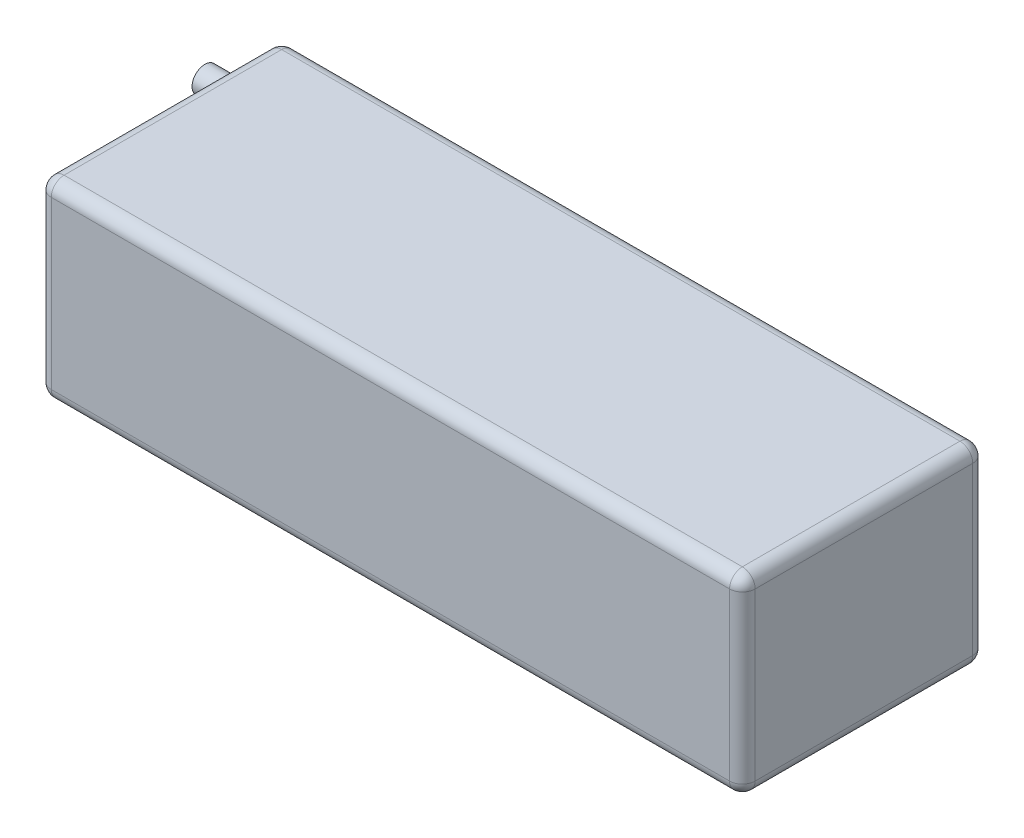
ISO-10303-21;
HEADER;
FILE_DESCRIPTION(('STEP AP214'),'2;1');
FILE_NAME('part.step','',(''),(''),'','','');
FILE_SCHEMA(('AUTOMOTIVE_DESIGN { 1 0 10303 214 1 1 1 1 }'));
ENDSEC;
DATA;
#1=APPLICATION_CONTEXT('core data for automotive mechanical design processes');
#2=APPLICATION_PROTOCOL_DEFINITION('international standard','automotive_design',2000,#1);
#3=PRODUCT_CONTEXT('',#1,'mechanical');
#4=PRODUCT('Part','Part','',(#3));
#5=PRODUCT_RELATED_PRODUCT_CATEGORY('part','',(#4));
#6=PRODUCT_DEFINITION_FORMATION('','',#4);
#7=PRODUCT_DEFINITION_CONTEXT('part definition',#1,'design');
#8=PRODUCT_DEFINITION('design','',#6,#7);
#9=PRODUCT_DEFINITION_SHAPE('','',#8);
#10=(LENGTH_UNIT() NAMED_UNIT(*) SI_UNIT(.MILLI.,.METRE.));
#11=(NAMED_UNIT(*) PLANE_ANGLE_UNIT() SI_UNIT($,.RADIAN.));
#12=(NAMED_UNIT(*) SI_UNIT($,.STERADIAN.) SOLID_ANGLE_UNIT());
#13=UNCERTAINTY_MEASURE_WITH_UNIT(LENGTH_MEASURE(1.E-05),#10,'distance_accuracy_value','');
#14=(GEOMETRIC_REPRESENTATION_CONTEXT(3) GLOBAL_UNCERTAINTY_ASSIGNED_CONTEXT((#13)) GLOBAL_UNIT_ASSIGNED_CONTEXT((#10,
#11,#12)) REPRESENTATION_CONTEXT('',''));
#15=CARTESIAN_POINT('',(0.,0.,0.));
#16=DIRECTION('',(0.,0.,1.));
#17=DIRECTION('',(1.,0.,0.));
#18=AXIS2_PLACEMENT_3D('',#15,#16,#17);
#19=CARTESIAN_POINT('',(-55.,30.,19.));
#20=DIRECTION('',(1.,0.,0.));
#21=DIRECTION('',(0.,0.,-1.));
#22=AXIS2_PLACEMENT_3D('',#19,#20,#21);
#23=PLANE('',#22);
#24=CARTESIAN_POINT('',(-55.,10.,-17.));
#25=DIRECTION('',(1.,0.,0.));
#26=DIRECTION('',(0.,0.,-1.));
#27=AXIS2_PLACEMENT_3D('',#24,#25,#26);
#28=CIRCLE('',#27,2.);
#29=CARTESIAN_POINT('',(-55.,8.,-17.));
#30=VERTEX_POINT('',#29);
#31=CARTESIAN_POINT('',(-55.,12.,-17.));
#32=VERTEX_POINT('',#31);
#33=EDGE_CURVE('E50',#30,#32,#28,.F.);
#34=ORIENTED_EDGE('',*,*,#33,.F.);
#35=DIRECTION('',(0.,-1.,0.));
#36=VECTOR('',#35,1.);
#37=CARTESIAN_POINT('',(-55.,30.,-17.));
#38=LINE('',#37,#36);
#39=CARTESIAN_POINT('',(-55.,2.,-17.));
#40=VERTEX_POINT('',#39);
#41=EDGE_CURVE('E168',#30,#40,#38,.T.);
#42=ORIENTED_EDGE('',*,*,#41,.T.);
#43=DIRECTION('',(0.,0.,1.));
#44=VECTOR('',#43,1.);
#45=CARTESIAN_POINT('',(-55.,2.,19.));
#46=LINE('',#45,#44);
#47=CARTESIAN_POINT('',(-55.,2.,17.));
#48=VERTEX_POINT('',#47);
#49=EDGE_CURVE('E205',#40,#48,#46,.T.);
#50=ORIENTED_EDGE('',*,*,#49,.T.);
#51=DIRECTION('',(0.,-1.,0.));
#52=VECTOR('',#51,1.);
#53=CARTESIAN_POINT('',(-55.,30.,17.));
#54=LINE('',#53,#52);
#55=CARTESIAN_POINT('',(-55.,28.,17.));
#56=VERTEX_POINT('',#55);
#57=EDGE_CURVE('E203',#48,#56,#54,.F.);
#58=ORIENTED_EDGE('',*,*,#57,.T.);
#59=DIRECTION('',(0.,0.,1.));
#60=VECTOR('',#59,1.);
#61=CARTESIAN_POINT('',(-55.,28.,-19.));
#62=LINE('',#61,#60);
#63=CARTESIAN_POINT('',(-55.,28.,-17.));
#64=VERTEX_POINT('',#63);
#65=EDGE_CURVE('E201',#56,#64,#62,.F.);
#66=ORIENTED_EDGE('',*,*,#65,.T.);
#67=CARTESIAN_POINT('',(-55.,22.,-17.));
#68=VERTEX_POINT('',#67);
#69=EDGE_CURVE('E197',#64,#68,#38,.T.);
#70=ORIENTED_EDGE('',*,*,#69,.T.);
#71=CARTESIAN_POINT('',(-55.,20.,-17.));
#72=DIRECTION('',(1.,0.,0.));
#73=DIRECTION('',(0.,0.,-1.));
#74=AXIS2_PLACEMENT_3D('',#71,#72,#73);
#75=CIRCLE('',#74,2.);
#76=CARTESIAN_POINT('',(-55.,18.,-17.));
#77=VERTEX_POINT('',#76);
#78=EDGE_CURVE('E208',#77,#68,#75,.F.);
#79=ORIENTED_EDGE('',*,*,#78,.F.);
#80=CARTESIAN_POINT('',(-55.,17.,-17.));
#81=VERTEX_POINT('',#80);
#82=EDGE_CURVE('E200',#77,#81,#38,.T.);
#83=ORIENTED_EDGE('',*,*,#82,.T.);
#84=CARTESIAN_POINT('',(-55.,15.,-17.));
#85=DIRECTION('',(1.,0.,0.));
#86=DIRECTION('',(0.,0.,-1.));
#87=AXIS2_PLACEMENT_3D('',#84,#85,#86);
#88=CIRCLE('',#87,2.);
#89=CARTESIAN_POINT('',(-55.,13.,-17.));
#90=VERTEX_POINT('',#89);
#91=EDGE_CURVE('E58',#90,#81,#88,.F.);
#92=ORIENTED_EDGE('',*,*,#91,.F.);
#93=EDGE_CURVE('E691',#90,#32,#38,.T.);
#94=ORIENTED_EDGE('',*,*,#93,.T.);
#95=EDGE_LOOP('',(#34,#42,#50,#58,#66,#70,#79,#83,#92,#94));
#96=FACE_BOUND('',#95,.T.);
#97=ADVANCED_FACE('F35',(#96),#23,.F.);
#98=CARTESIAN_POINT('',(-53.,30.,-17.));
#99=DIRECTION('',(0.,-1.,0.));
#100=DIRECTION('',(0.,0.,-1.));
#101=AXIS2_PLACEMENT_3D('',#98,#99,#100);
#102=CYLINDRICAL_SURFACE('',#101,2.);
#103=ORIENTED_EDGE('',*,*,#41,.F.);
#104=CARTESIAN_POINT('',(-53.,10.,-17.));
#105=DIRECTION('',(0.707106781186547,-0.707106781186547,0.));
#106=DIRECTION('',(-0.707106781186547,-0.707106781186547,0.));
#107=AXIS2_PLACEMENT_3D('',#104,#105,#106);
#108=ELLIPSE('',#107,2.82842712474619,2.);
#109=CARTESIAN_POINT('',(-53.,10.,-19.));
#110=VERTEX_POINT('',#109);
#111=EDGE_CURVE('E153',#30,#110,#108,.T.);
#112=ORIENTED_EDGE('',*,*,#111,.T.);
#113=DIRECTION('',(0.,-1.,0.));
#114=VECTOR('',#113,1.);
#115=CARTESIAN_POINT('',(-53.,30.,-19.));
#116=LINE('',#115,#114);
#117=CARTESIAN_POINT('',(-53.,2.,-19.));
#118=VERTEX_POINT('',#117);
#119=EDGE_CURVE('E166',#118,#110,#116,.F.);
#120=ORIENTED_EDGE('',*,*,#119,.F.);
#121=CARTESIAN_POINT('',(-53.,2.,-17.));
#122=DIRECTION('',(0.,-1.,0.));
#123=DIRECTION('',(0.,0.,-1.));
#124=AXIS2_PLACEMENT_3D('',#121,#122,#123);
#125=CIRCLE('',#124,2.);
#126=EDGE_CURVE('E210',#118,#40,#125,.F.);
#127=ORIENTED_EDGE('',*,*,#126,.T.);
#128=EDGE_LOOP('',(#103,#112,#120,#127));
#129=FACE_BOUND('',#128,.T.);
#130=ADVANCED_FACE('F163',(#129),#102,.T.);
#131=CARTESIAN_POINT('',(-53.,15.,-19.));
#132=VERTEX_POINT('',#131);
#133=EDGE_CURVE('E172',#110,#132,#116,.F.);
#134=ORIENTED_EDGE('',*,*,#133,.F.);
#135=CARTESIAN_POINT('',(-53.,10.,-17.));
#136=DIRECTION('',(-0.707106781186547,-0.707106781186547,0.));
#137=DIRECTION('',(0.707106781186547,-0.707106781186547,0.));
#138=AXIS2_PLACEMENT_3D('',#135,#136,#137);
#139=ELLIPSE('',#138,2.82842712474619,2.);
#140=EDGE_CURVE('E149',#110,#32,#139,.F.);
#141=ORIENTED_EDGE('',*,*,#140,.T.);
#142=ORIENTED_EDGE('',*,*,#93,.F.);
#143=CARTESIAN_POINT('',(-53.,15.,-17.));
#144=DIRECTION('',(0.707106781186547,-0.707106781186547,0.));
#145=DIRECTION('',(-0.707106781186547,-0.707106781186547,0.));
#146=AXIS2_PLACEMENT_3D('',#143,#144,#145);
#147=ELLIPSE('',#146,2.82842712474619,2.);
#148=EDGE_CURVE('E174',#90,#132,#147,.T.);
#149=ORIENTED_EDGE('',*,*,#148,.T.);
#150=EDGE_LOOP('',(#134,#141,#142,#149));
#151=FACE_BOUND('',#150,.T.);
#152=ADVANCED_FACE('F173',(#151),#102,.T.);
#153=CARTESIAN_POINT('',(-53.,20.,-19.));
#154=VERTEX_POINT('',#153);
#155=EDGE_CURVE('E177',#132,#154,#116,.F.);
#156=ORIENTED_EDGE('',*,*,#155,.F.);
#157=CARTESIAN_POINT('',(-53.,15.,-17.));
#158=DIRECTION('',(-0.707106781186547,-0.707106781186547,0.));
#159=DIRECTION('',(0.707106781186547,-0.707106781186547,0.));
#160=AXIS2_PLACEMENT_3D('',#157,#158,#159);
#161=ELLIPSE('',#160,2.82842712474619,2.);
#162=EDGE_CURVE('E216',#132,#81,#161,.F.);
#163=ORIENTED_EDGE('',*,*,#162,.T.);
#164=ORIENTED_EDGE('',*,*,#82,.F.);
#165=CARTESIAN_POINT('',(-53.,20.,-17.));
#166=DIRECTION('',(0.707106781186547,-0.707106781186547,0.));
#167=DIRECTION('',(-0.707106781186547,-0.707106781186547,0.));
#168=AXIS2_PLACEMENT_3D('',#165,#166,#167);
#169=ELLIPSE('',#168,2.82842712474619,2.);
#170=EDGE_CURVE('E11',#77,#154,#169,.T.);
#171=ORIENTED_EDGE('',*,*,#170,.T.);
#172=EDGE_LOOP('',(#156,#163,#164,#171));
#173=FACE_BOUND('',#172,.T.);
#174=ADVANCED_FACE('F481',(#173),#102,.T.);
#175=CARTESIAN_POINT('',(-53.,28.,-19.));
#176=VERTEX_POINT('',#175);
#177=EDGE_CURVE('E184',#154,#176,#116,.F.);
#178=ORIENTED_EDGE('',*,*,#177,.F.);
#179=CARTESIAN_POINT('',(-53.,20.,-17.));
#180=DIRECTION('',(-0.707106781186547,-0.707106781186547,0.));
#181=DIRECTION('',(0.707106781186547,-0.707106781186547,0.));
#182=AXIS2_PLACEMENT_3D('',#179,#180,#181);
#183=ELLIPSE('',#182,2.82842712474619,2.);
#184=EDGE_CURVE('E43',#154,#68,#183,.F.);
#185=ORIENTED_EDGE('',*,*,#184,.T.);
#186=ORIENTED_EDGE('',*,*,#69,.F.);
#187=CARTESIAN_POINT('',(-53.,28.,-17.));
#188=DIRECTION('',(0.,1.,0.));
#189=DIRECTION('',(0.,0.,1.));
#190=AXIS2_PLACEMENT_3D('',#187,#188,#189);
#191=CIRCLE('',#190,2.);
#192=EDGE_CURVE('E372',#64,#176,#191,.F.);
#193=ORIENTED_EDGE('',*,*,#192,.T.);
#194=EDGE_LOOP('',(#178,#185,#186,#193));
#195=FACE_BOUND('',#194,.T.);
#196=ADVANCED_FACE('F243',(#195),#102,.T.);
#197=CARTESIAN_POINT('',(55.,30.,19.));
#198=DIRECTION('',(0.,0.,-1.));
#199=DIRECTION('',(-1.,0.,0.));
#200=AXIS2_PLACEMENT_3D('',#197,#198,#199);
#201=PLANE('',#200);
#202=DIRECTION('',(1.,0.,0.));
#203=VECTOR('',#202,1.);
#204=CARTESIAN_POINT('',(-55.,28.,19.));
#205=LINE('',#204,#203);
#206=CARTESIAN_POINT('',(53.,28.,19.));
#207=VERTEX_POINT('',#206);
#208=CARTESIAN_POINT('',(-53.,28.,19.));
#209=VERTEX_POINT('',#208);
#210=EDGE_CURVE('E338',#207,#209,#205,.F.);
#211=ORIENTED_EDGE('',*,*,#210,.T.);
#212=DIRECTION('',(0.,-1.,0.));
#213=VECTOR('',#212,1.);
#214=CARTESIAN_POINT('',(-53.,30.,19.));
#215=LINE('',#214,#213);
#216=CARTESIAN_POINT('',(-53.,2.,19.));
#217=VERTEX_POINT('',#216);
#218=EDGE_CURVE('E345',#209,#217,#215,.T.);
#219=ORIENTED_EDGE('',*,*,#218,.T.);
#220=DIRECTION('',(1.,0.,0.));
#221=VECTOR('',#220,1.);
#222=CARTESIAN_POINT('',(55.,2.,19.));
#223=LINE('',#222,#221);
#224=CARTESIAN_POINT('',(53.,2.,19.));
#225=VERTEX_POINT('',#224);
#226=EDGE_CURVE('E350',#217,#225,#223,.T.);
#227=ORIENTED_EDGE('',*,*,#226,.T.);
#228=DIRECTION('',(0.,-1.,0.));
#229=VECTOR('',#228,1.);
#230=CARTESIAN_POINT('',(53.,30.,19.));
#231=LINE('',#230,#229);
#232=EDGE_CURVE('E346',#225,#207,#231,.F.);
#233=ORIENTED_EDGE('',*,*,#232,.T.);
#234=EDGE_LOOP('',(#211,#219,#227,#233));
#235=FACE_BOUND('',#234,.T.);
#236=ADVANCED_FACE('F245',(#235),#201,.F.);
#237=CARTESIAN_POINT('',(55.,30.,19.));
#238=DIRECTION('',(-1.,0.,0.));
#239=DIRECTION('',(0.,0.,1.));
#240=AXIS2_PLACEMENT_3D('',#237,#238,#239);
#241=PLANE('',#240);
#242=DIRECTION('',(0.,0.,-1.));
#243=VECTOR('',#242,1.);
#244=CARTESIAN_POINT('',(55.,28.,19.));
#245=LINE('',#244,#243);
#246=CARTESIAN_POINT('',(55.,28.,-17.));
#247=VERTEX_POINT('',#246);
#248=CARTESIAN_POINT('',(55.,28.,17.));
#249=VERTEX_POINT('',#248);
#250=EDGE_CURVE('E357',#247,#249,#245,.F.);
#251=ORIENTED_EDGE('',*,*,#250,.T.);
#252=DIRECTION('',(0.,-1.,0.));
#253=VECTOR('',#252,1.);
#254=CARTESIAN_POINT('',(55.,30.,17.));
#255=LINE('',#254,#253);
#256=CARTESIAN_POINT('',(55.,2.,17.));
#257=VERTEX_POINT('',#256);
#258=EDGE_CURVE('E359',#249,#257,#255,.T.);
#259=ORIENTED_EDGE('',*,*,#258,.T.);
#260=DIRECTION('',(0.,0.,-1.));
#261=VECTOR('',#260,1.);
#262=CARTESIAN_POINT('',(55.,2.,19.));
#263=LINE('',#262,#261);
#264=CARTESIAN_POINT('',(55.,2.,-17.));
#265=VERTEX_POINT('',#264);
#266=EDGE_CURVE('E348',#257,#265,#263,.T.);
#267=ORIENTED_EDGE('',*,*,#266,.T.);
#268=DIRECTION('',(0.,-1.,0.));
#269=VECTOR('',#268,1.);
#270=CARTESIAN_POINT('',(55.,30.,-17.));
#271=LINE('',#270,#269);
#272=EDGE_CURVE('E355',#265,#247,#271,.F.);
#273=ORIENTED_EDGE('',*,*,#272,.T.);
#274=EDGE_LOOP('',(#251,#259,#267,#273));
#275=FACE_BOUND('',#274,.T.);
#276=ADVANCED_FACE('F469',(#275),#241,.F.);
#277=CARTESIAN_POINT('',(55.,30.,-19.));
#278=DIRECTION('',(0.,0.,1.));
#279=DIRECTION('',(1.,0.,0.));
#280=AXIS2_PLACEMENT_3D('',#277,#278,#279);
#281=PLANE('',#280);
#282=ORIENTED_EDGE('',*,*,#119,.T.);
#283=ORIENTED_EDGE('',*,*,#133,.T.);
#284=ORIENTED_EDGE('',*,*,#155,.T.);
#285=ORIENTED_EDGE('',*,*,#177,.T.);
#286=DIRECTION('',(-1.,0.,0.));
#287=VECTOR('',#286,1.);
#288=CARTESIAN_POINT('',(55.,28.,-19.));
#289=LINE('',#288,#287);
#290=CARTESIAN_POINT('',(53.,28.,-19.));
#291=VERTEX_POINT('',#290);
#292=EDGE_CURVE('E188',#176,#291,#289,.F.);
#293=ORIENTED_EDGE('',*,*,#292,.T.);
#294=DIRECTION('',(0.,-1.,0.));
#295=VECTOR('',#294,1.);
#296=CARTESIAN_POINT('',(53.,30.,-19.));
#297=LINE('',#296,#295);
#298=CARTESIAN_POINT('',(53.,2.,-19.));
#299=VERTEX_POINT('',#298);
#300=EDGE_CURVE('E191',#291,#299,#297,.T.);
#301=ORIENTED_EDGE('',*,*,#300,.T.);
#302=DIRECTION('',(-1.,0.,0.));
#303=VECTOR('',#302,1.);
#304=CARTESIAN_POINT('',(55.,2.,-19.));
#305=LINE('',#304,#303);
#306=EDGE_CURVE('E181',#299,#118,#305,.T.);
#307=ORIENTED_EDGE('',*,*,#306,.T.);
#308=EDGE_LOOP('',(#282,#283,#284,#285,#293,#301,#307));
#309=FACE_BOUND('',#308,.T.);
#310=ADVANCED_FACE('F179',(#309),#281,.F.);
#311=CARTESIAN_POINT('',(0.,30.,0.));
#312=DIRECTION('',(0.,1.,0.));
#313=DIRECTION('',(0.,0.,1.));
#314=AXIS2_PLACEMENT_3D('',#311,#312,#313);
#315=PLANE('',#314);
#316=DIRECTION('',(0.,0.,-1.));
#317=VECTOR('',#316,1.);
#318=CARTESIAN_POINT('',(53.,30.,-19.));
#319=LINE('',#318,#317);
#320=CARTESIAN_POINT('',(53.,30.,17.));
#321=VERTEX_POINT('',#320);
#322=CARTESIAN_POINT('',(53.,30.,-17.));
#323=VERTEX_POINT('',#322);
#324=EDGE_CURVE('E183',#321,#323,#319,.T.);
#325=ORIENTED_EDGE('',*,*,#324,.T.);
#326=DIRECTION('',(-1.,0.,0.));
#327=VECTOR('',#326,1.);
#328=CARTESIAN_POINT('',(-55.,30.,-17.));
#329=LINE('',#328,#327);
#330=CARTESIAN_POINT('',(-53.,30.,-17.));
#331=VERTEX_POINT('',#330);
#332=EDGE_CURVE('E445',#323,#331,#329,.T.);
#333=ORIENTED_EDGE('',*,*,#332,.T.);
#334=DIRECTION('',(0.,0.,1.));
#335=VECTOR('',#334,1.);
#336=CARTESIAN_POINT('',(-53.,30.,19.));
#337=LINE('',#336,#335);
#338=CARTESIAN_POINT('',(-53.,30.,17.));
#339=VERTEX_POINT('',#338);
#340=EDGE_CURVE('E440',#331,#339,#337,.T.);
#341=ORIENTED_EDGE('',*,*,#340,.T.);
#342=DIRECTION('',(1.,0.,0.));
#343=VECTOR('',#342,1.);
#344=CARTESIAN_POINT('',(55.,30.,17.));
#345=LINE('',#344,#343);
#346=EDGE_CURVE('E185',#339,#321,#345,.T.);
#347=ORIENTED_EDGE('',*,*,#346,.T.);
#348=EDGE_LOOP('',(#325,#333,#341,#347));
#349=FACE_BOUND('',#348,.T.);
#350=ADVANCED_FACE('F472',(#349),#315,.T.);
#351=CARTESIAN_POINT('',(0.,0.,0.));
#352=DIRECTION('',(0.,1.,0.));
#353=DIRECTION('',(0.,0.,1.));
#354=AXIS2_PLACEMENT_3D('',#351,#352,#353);
#355=PLANE('',#354);
#356=DIRECTION('',(0.,0.,-1.));
#357=VECTOR('',#356,1.);
#358=CARTESIAN_POINT('',(53.,0.,0.));
#359=LINE('',#358,#357);
#360=CARTESIAN_POINT('',(53.,0.,-17.));
#361=VERTEX_POINT('',#360);
#362=CARTESIAN_POINT('',(53.,0.,17.));
#363=VERTEX_POINT('',#362);
#364=EDGE_CURVE('E366',#361,#363,#359,.F.);
#365=ORIENTED_EDGE('',*,*,#364,.T.);
#366=DIRECTION('',(1.,0.,0.));
#367=VECTOR('',#366,1.);
#368=CARTESIAN_POINT('',(0.,0.,17.));
#369=LINE('',#368,#367);
#370=CARTESIAN_POINT('',(-53.,0.,17.));
#371=VERTEX_POINT('',#370);
#372=EDGE_CURVE('E368',#363,#371,#369,.F.);
#373=ORIENTED_EDGE('',*,*,#372,.T.);
#374=DIRECTION('',(0.,0.,1.));
#375=VECTOR('',#374,1.);
#376=CARTESIAN_POINT('',(-53.,0.,0.));
#377=LINE('',#376,#375);
#378=CARTESIAN_POINT('',(-53.,0.,-17.));
#379=VERTEX_POINT('',#378);
#380=EDGE_CURVE('E362',#371,#379,#377,.F.);
#381=ORIENTED_EDGE('',*,*,#380,.T.);
#382=DIRECTION('',(-1.,0.,0.));
#383=VECTOR('',#382,1.);
#384=CARTESIAN_POINT('',(0.,0.,-17.));
#385=LINE('',#384,#383);
#386=EDGE_CURVE('E364',#379,#361,#385,.F.);
#387=ORIENTED_EDGE('',*,*,#386,.T.);
#388=EDGE_LOOP('',(#365,#373,#381,#387));
#389=FACE_BOUND('',#388,.T.);
#390=ADVANCED_FACE('F322',(#389),#355,.F.);
#391=CARTESIAN_POINT('',(53.,30.,17.));
#392=DIRECTION('',(0.,-1.,0.));
#393=DIRECTION('',(0.,0.,-1.));
#394=AXIS2_PLACEMENT_3D('',#391,#392,#393);
#395=CYLINDRICAL_SURFACE('',#394,2.);
#396=CARTESIAN_POINT('',(53.,28.,17.));
#397=DIRECTION('',(0.,1.,0.));
#398=DIRECTION('',(0.,0.,1.));
#399=AXIS2_PLACEMENT_3D('',#396,#397,#398);
#400=CIRCLE('',#399,2.);
#401=EDGE_CURVE('E207',#207,#249,#400,.T.);
#402=ORIENTED_EDGE('',*,*,#401,.F.);
#403=ORIENTED_EDGE('',*,*,#232,.F.);
#404=CARTESIAN_POINT('',(53.,2.,17.));
#405=DIRECTION('',(0.,-1.,0.));
#406=DIRECTION('',(0.,0.,-1.));
#407=AXIS2_PLACEMENT_3D('',#404,#405,#406);
#408=CIRCLE('',#407,2.);
#409=EDGE_CURVE('E423',#257,#225,#408,.T.);
#410=ORIENTED_EDGE('',*,*,#409,.F.);
#411=ORIENTED_EDGE('',*,*,#258,.F.);
#412=EDGE_LOOP('',(#402,#403,#410,#411));
#413=FACE_BOUND('',#412,.T.);
#414=ADVANCED_FACE('F37',(#413),#395,.T.);
#415=CARTESIAN_POINT('',(53.,28.,17.));
#416=DIRECTION('',(0.,0.,1.));
#417=DIRECTION('',(1.,0.,0.));
#418=AXIS2_PLACEMENT_3D('',#415,#416,#417);
#419=SPHERICAL_SURFACE('',#418,2.);
#420=CARTESIAN_POINT('',(53.,28.,17.));
#421=DIRECTION('',(1.,0.,0.));
#422=DIRECTION('',(0.,0.,-1.));
#423=AXIS2_PLACEMENT_3D('',#420,#421,#422);
#424=CIRCLE('',#423,2.);
#425=EDGE_CURVE('E328',#207,#321,#424,.F.);
#426=ORIENTED_EDGE('',*,*,#425,.F.);
#427=ORIENTED_EDGE('',*,*,#401,.T.);
#428=CARTESIAN_POINT('',(53.,28.,17.));
#429=DIRECTION('',(0.,0.,1.));
#430=DIRECTION('',(1.,0.,0.));
#431=AXIS2_PLACEMENT_3D('',#428,#429,#430);
#432=CIRCLE('',#431,2.);
#433=EDGE_CURVE('E332',#321,#249,#432,.F.);
#434=ORIENTED_EDGE('',*,*,#433,.F.);
#435=EDGE_LOOP('',(#426,#427,#434));
#436=FACE_BOUND('',#435,.T.);
#437=ADVANCED_FACE('F315',(#436),#419,.T.);
#438=CARTESIAN_POINT('',(53.,2.,17.));
#439=DIRECTION('',(0.,0.,1.));
#440=DIRECTION('',(1.,0.,0.));
#441=AXIS2_PLACEMENT_3D('',#438,#439,#440);
#442=SPHERICAL_SURFACE('',#441,2.);
#443=CARTESIAN_POINT('',(53.,2.,17.));
#444=DIRECTION('',(0.,0.,1.));
#445=DIRECTION('',(1.,0.,0.));
#446=AXIS2_PLACEMENT_3D('',#443,#444,#445);
#447=CIRCLE('',#446,2.);
#448=EDGE_CURVE('E417',#257,#363,#447,.F.);
#449=ORIENTED_EDGE('',*,*,#448,.F.);
#450=ORIENTED_EDGE('',*,*,#409,.T.);
#451=CARTESIAN_POINT('',(53.,2.,17.));
#452=DIRECTION('',(1.,0.,0.));
#453=DIRECTION('',(0.,0.,-1.));
#454=AXIS2_PLACEMENT_3D('',#451,#452,#453);
#455=CIRCLE('',#454,2.);
#456=EDGE_CURVE('E335',#363,#225,#455,.F.);
#457=ORIENTED_EDGE('',*,*,#456,.F.);
#458=EDGE_LOOP('',(#449,#450,#457));
#459=FACE_BOUND('',#458,.T.);
#460=ADVANCED_FACE('F312',(#459),#442,.T.);
#461=CARTESIAN_POINT('',(53.,28.,0.));
#462=DIRECTION('',(0.,0.,1.));
#463=DIRECTION('',(1.,0.,0.));
#464=AXIS2_PLACEMENT_3D('',#461,#462,#463);
#465=CYLINDRICAL_SURFACE('',#464,2.);
#466=ORIENTED_EDGE('',*,*,#433,.T.);
#467=ORIENTED_EDGE('',*,*,#250,.F.);
#468=CARTESIAN_POINT('',(53.,28.,-17.));
#469=DIRECTION('',(0.,0.,-1.));
#470=DIRECTION('',(-1.,0.,0.));
#471=AXIS2_PLACEMENT_3D('',#468,#469,#470);
#472=CIRCLE('',#471,2.);
#473=EDGE_CURVE('E411',#323,#247,#472,.T.);
#474=ORIENTED_EDGE('',*,*,#473,.F.);
#475=ORIENTED_EDGE('',*,*,#324,.F.);
#476=EDGE_LOOP('',(#466,#467,#474,#475));
#477=FACE_BOUND('',#476,.T.);
#478=ADVANCED_FACE('F308',(#477),#465,.T.);
#479=CARTESIAN_POINT('',(0.,28.,17.));
#480=DIRECTION('',(-1.,0.,0.));
#481=DIRECTION('',(0.,0.,1.));
#482=AXIS2_PLACEMENT_3D('',#479,#480,#481);
#483=CYLINDRICAL_SURFACE('',#482,2.);
#484=ORIENTED_EDGE('',*,*,#425,.T.);
#485=ORIENTED_EDGE('',*,*,#346,.F.);
#486=CARTESIAN_POINT('',(-53.,28.,17.));
#487=DIRECTION('',(-1.,0.,0.));
#488=DIRECTION('',(0.,0.,1.));
#489=AXIS2_PLACEMENT_3D('',#486,#487,#488);
#490=CIRCLE('',#489,2.);
#491=EDGE_CURVE('E340',#209,#339,#490,.T.);
#492=ORIENTED_EDGE('',*,*,#491,.F.);
#493=ORIENTED_EDGE('',*,*,#210,.F.);
#494=EDGE_LOOP('',(#484,#485,#492,#493));
#495=FACE_BOUND('',#494,.T.);
#496=ADVANCED_FACE('F304',(#495),#483,.T.);
#497=CARTESIAN_POINT('',(-53.,30.,17.));
#498=DIRECTION('',(0.,-1.,0.));
#499=DIRECTION('',(0.,0.,-1.));
#500=AXIS2_PLACEMENT_3D('',#497,#498,#499);
#501=CYLINDRICAL_SURFACE('',#500,2.);
#502=CARTESIAN_POINT('',(-53.,2.,17.));
#503=DIRECTION('',(0.,-1.,0.));
#504=DIRECTION('',(0.,0.,-1.));
#505=AXIS2_PLACEMENT_3D('',#502,#503,#504);
#506=CIRCLE('',#505,2.);
#507=EDGE_CURVE('E405',#217,#48,#506,.T.);
#508=ORIENTED_EDGE('',*,*,#507,.F.);
#509=ORIENTED_EDGE('',*,*,#218,.F.);
#510=CARTESIAN_POINT('',(-53.,28.,17.));
#511=DIRECTION('',(0.,1.,0.));
#512=DIRECTION('',(0.,0.,1.));
#513=AXIS2_PLACEMENT_3D('',#510,#511,#512);
#514=CIRCLE('',#513,2.);
#515=EDGE_CURVE('E408',#56,#209,#514,.T.);
#516=ORIENTED_EDGE('',*,*,#515,.F.);
#517=ORIENTED_EDGE('',*,*,#57,.F.);
#518=EDGE_LOOP('',(#508,#509,#516,#517));
#519=FACE_BOUND('',#518,.T.);
#520=ADVANCED_FACE('F300',(#519),#501,.T.);
#521=CARTESIAN_POINT('',(55.,2.,17.));
#522=DIRECTION('',(1.,0.,0.));
#523=DIRECTION('',(0.,0.,-1.));
#524=AXIS2_PLACEMENT_3D('',#521,#522,#523);
#525=CYLINDRICAL_SURFACE('',#524,2.);
#526=ORIENTED_EDGE('',*,*,#456,.T.);
#527=ORIENTED_EDGE('',*,*,#226,.F.);
#528=CARTESIAN_POINT('',(-53.,2.,17.));
#529=DIRECTION('',(-1.,0.,0.));
#530=DIRECTION('',(0.,0.,1.));
#531=AXIS2_PLACEMENT_3D('',#528,#529,#530);
#532=CIRCLE('',#531,2.);
#533=EDGE_CURVE('E403',#371,#217,#532,.T.);
#534=ORIENTED_EDGE('',*,*,#533,.F.);
#535=ORIENTED_EDGE('',*,*,#372,.F.);
#536=EDGE_LOOP('',(#526,#527,#534,#535));
#537=FACE_BOUND('',#536,.T.);
#538=ADVANCED_FACE('F296',(#537),#525,.T.);
#539=CARTESIAN_POINT('',(53.,2.,19.));
#540=DIRECTION('',(0.,0.,-1.));
#541=DIRECTION('',(-1.,0.,0.));
#542=AXIS2_PLACEMENT_3D('',#539,#540,#541);
#543=CYLINDRICAL_SURFACE('',#542,2.);
#544=ORIENTED_EDGE('',*,*,#448,.T.);
#545=ORIENTED_EDGE('',*,*,#364,.F.);
#546=CARTESIAN_POINT('',(53.,2.,-17.));
#547=DIRECTION('',(0.,0.,-1.));
#548=DIRECTION('',(-1.,0.,0.));
#549=AXIS2_PLACEMENT_3D('',#546,#547,#548);
#550=CIRCLE('',#549,2.);
#551=EDGE_CURVE('E400',#265,#361,#550,.T.);
#552=ORIENTED_EDGE('',*,*,#551,.F.);
#553=ORIENTED_EDGE('',*,*,#266,.F.);
#554=EDGE_LOOP('',(#544,#545,#552,#553));
#555=FACE_BOUND('',#554,.T.);
#556=ADVANCED_FACE('F292',(#555),#543,.T.);
#557=CARTESIAN_POINT('',(53.,30.,-17.));
#558=DIRECTION('',(0.,-1.,0.));
#559=DIRECTION('',(0.,0.,-1.));
#560=AXIS2_PLACEMENT_3D('',#557,#558,#559);
#561=CYLINDRICAL_SURFACE('',#560,2.);
#562=CARTESIAN_POINT('',(53.,28.,-17.));
#563=DIRECTION('',(0.,1.,0.));
#564=DIRECTION('',(0.,0.,1.));
#565=AXIS2_PLACEMENT_3D('',#562,#563,#564);
#566=CIRCLE('',#565,2.);
#567=EDGE_CURVE('E414',#247,#291,#566,.T.);
#568=ORIENTED_EDGE('',*,*,#567,.F.);
#569=ORIENTED_EDGE('',*,*,#272,.F.);
#570=CARTESIAN_POINT('',(53.,2.,-17.));
#571=DIRECTION('',(0.,-1.,0.));
#572=DIRECTION('',(0.,0.,-1.));
#573=AXIS2_PLACEMENT_3D('',#570,#571,#572);
#574=CIRCLE('',#573,2.);
#575=EDGE_CURVE('E397',#299,#265,#574,.T.);
#576=ORIENTED_EDGE('',*,*,#575,.F.);
#577=ORIENTED_EDGE('',*,*,#300,.F.);
#578=EDGE_LOOP('',(#568,#569,#576,#577));
#579=FACE_BOUND('',#578,.T.);
#580=ADVANCED_FACE('F288',(#579),#561,.T.);
#581=CARTESIAN_POINT('',(53.,28.,-17.));
#582=DIRECTION('',(0.,0.,1.));
#583=DIRECTION('',(1.,0.,0.));
#584=AXIS2_PLACEMENT_3D('',#581,#582,#583);
#585=SPHERICAL_SURFACE('',#584,2.);
#586=ORIENTED_EDGE('',*,*,#473,.T.);
#587=ORIENTED_EDGE('',*,*,#567,.T.);
#588=CARTESIAN_POINT('',(53.,28.,-17.));
#589=DIRECTION('',(1.,0.,0.));
#590=DIRECTION('',(0.,0.,-1.));
#591=AXIS2_PLACEMENT_3D('',#588,#589,#590);
#592=CIRCLE('',#591,2.);
#593=EDGE_CURVE('E394',#323,#291,#592,.F.);
#594=ORIENTED_EDGE('',*,*,#593,.F.);
#595=EDGE_LOOP('',(#586,#587,#594));
#596=FACE_BOUND('',#595,.T.);
#597=ADVANCED_FACE('F284',(#596),#585,.T.);
#598=CARTESIAN_POINT('',(-53.,28.,17.));
#599=DIRECTION('',(0.,0.,1.));
#600=DIRECTION('',(1.,0.,0.));
#601=AXIS2_PLACEMENT_3D('',#598,#599,#600);
#602=SPHERICAL_SURFACE('',#601,2.);
#603=ORIENTED_EDGE('',*,*,#515,.T.);
#604=ORIENTED_EDGE('',*,*,#491,.T.);
#605=CARTESIAN_POINT('',(-53.,28.,17.));
#606=DIRECTION('',(0.,0.,1.));
#607=DIRECTION('',(1.,0.,0.));
#608=AXIS2_PLACEMENT_3D('',#605,#606,#607);
#609=CIRCLE('',#608,2.);
#610=EDGE_CURVE('E391',#56,#339,#609,.F.);
#611=ORIENTED_EDGE('',*,*,#610,.F.);
#612=EDGE_LOOP('',(#603,#604,#611));
#613=FACE_BOUND('',#612,.T.);
#614=ADVANCED_FACE('F280',(#613),#602,.T.);
#615=CARTESIAN_POINT('',(-53.,2.,17.));
#616=DIRECTION('',(0.,0.,1.));
#617=DIRECTION('',(1.,0.,0.));
#618=AXIS2_PLACEMENT_3D('',#615,#616,#617);
#619=SPHERICAL_SURFACE('',#618,2.);
#620=ORIENTED_EDGE('',*,*,#533,.T.);
#621=ORIENTED_EDGE('',*,*,#507,.T.);
#622=CARTESIAN_POINT('',(-53.,2.,17.));
#623=DIRECTION('',(0.,0.,1.));
#624=DIRECTION('',(1.,0.,0.));
#625=AXIS2_PLACEMENT_3D('',#622,#623,#624);
#626=CIRCLE('',#625,2.);
#627=EDGE_CURVE('E388',#371,#48,#626,.F.);
#628=ORIENTED_EDGE('',*,*,#627,.F.);
#629=EDGE_LOOP('',(#620,#621,#628));
#630=FACE_BOUND('',#629,.T.);
#631=ADVANCED_FACE('F276',(#630),#619,.T.);
#632=CARTESIAN_POINT('',(53.,2.,-17.));
#633=DIRECTION('',(0.,0.,1.));
#634=DIRECTION('',(1.,0.,0.));
#635=AXIS2_PLACEMENT_3D('',#632,#633,#634);
#636=SPHERICAL_SURFACE('',#635,2.);
#637=ORIENTED_EDGE('',*,*,#575,.T.);
#638=ORIENTED_EDGE('',*,*,#551,.T.);
#639=CARTESIAN_POINT('',(53.,2.,-17.));
#640=DIRECTION('',(1.,0.,0.));
#641=DIRECTION('',(0.,0.,-1.));
#642=AXIS2_PLACEMENT_3D('',#639,#640,#641);
#643=CIRCLE('',#642,2.);
#644=EDGE_CURVE('E385',#299,#361,#643,.F.);
#645=ORIENTED_EDGE('',*,*,#644,.F.);
#646=EDGE_LOOP('',(#637,#638,#645));
#647=FACE_BOUND('',#646,.T.);
#648=ADVANCED_FACE('F272',(#647),#636,.T.);
#649=CARTESIAN_POINT('',(0.,28.,-17.));
#650=DIRECTION('',(1.,0.,0.));
#651=DIRECTION('',(0.,0.,-1.));
#652=AXIS2_PLACEMENT_3D('',#649,#650,#651);
#653=CYLINDRICAL_SURFACE('',#652,2.);
#654=ORIENTED_EDGE('',*,*,#593,.T.);
#655=ORIENTED_EDGE('',*,*,#292,.F.);
#656=CARTESIAN_POINT('',(-53.,28.,-17.));
#657=DIRECTION('',(-1.,0.,0.));
#658=DIRECTION('',(0.,0.,1.));
#659=AXIS2_PLACEMENT_3D('',#656,#657,#658);
#660=CIRCLE('',#659,2.);
#661=EDGE_CURVE('E382',#331,#176,#660,.T.);
#662=ORIENTED_EDGE('',*,*,#661,.F.);
#663=ORIENTED_EDGE('',*,*,#332,.F.);
#664=EDGE_LOOP('',(#654,#655,#662,#663));
#665=FACE_BOUND('',#664,.T.);
#666=ADVANCED_FACE('F268',(#665),#653,.T.);
#667=CARTESIAN_POINT('',(-53.,28.,0.));
#668=DIRECTION('',(0.,0.,-1.));
#669=DIRECTION('',(-1.,0.,0.));
#670=AXIS2_PLACEMENT_3D('',#667,#668,#669);
#671=CYLINDRICAL_SURFACE('',#670,2.);
#672=ORIENTED_EDGE('',*,*,#610,.T.);
#673=ORIENTED_EDGE('',*,*,#340,.F.);
#674=CARTESIAN_POINT('',(-53.,28.,-17.));
#675=DIRECTION('',(0.,0.,-1.));
#676=DIRECTION('',(0.,1.,0.));
#677=AXIS2_PLACEMENT_3D('',#674,#675,#676);
#678=CIRCLE('',#677,2.);
#679=EDGE_CURVE('E380',#64,#331,#678,.T.);
#680=ORIENTED_EDGE('',*,*,#679,.F.);
#681=ORIENTED_EDGE('',*,*,#65,.F.);
#682=EDGE_LOOP('',(#672,#673,#680,#681));
#683=FACE_BOUND('',#682,.T.);
#684=ADVANCED_FACE('F264',(#683),#671,.T.);
#685=CARTESIAN_POINT('',(-53.,2.,19.));
#686=DIRECTION('',(0.,0.,1.));
#687=DIRECTION('',(1.,0.,0.));
#688=AXIS2_PLACEMENT_3D('',#685,#686,#687);
#689=CYLINDRICAL_SURFACE('',#688,2.);
#690=ORIENTED_EDGE('',*,*,#627,.T.);
#691=ORIENTED_EDGE('',*,*,#49,.F.);
#692=CARTESIAN_POINT('',(-53.,2.,-17.));
#693=DIRECTION('',(0.,0.,-1.));
#694=DIRECTION('',(-1.,0.,0.));
#695=AXIS2_PLACEMENT_3D('',#692,#693,#694);
#696=CIRCLE('',#695,2.);
#697=EDGE_CURVE('E377',#379,#40,#696,.T.);
#698=ORIENTED_EDGE('',*,*,#697,.F.);
#699=ORIENTED_EDGE('',*,*,#380,.F.);
#700=EDGE_LOOP('',(#690,#691,#698,#699));
#701=FACE_BOUND('',#700,.T.);
#702=ADVANCED_FACE('F260',(#701),#689,.T.);
#703=CARTESIAN_POINT('',(55.,2.,-17.));
#704=DIRECTION('',(-1.,0.,0.));
#705=DIRECTION('',(0.,0.,1.));
#706=AXIS2_PLACEMENT_3D('',#703,#704,#705);
#707=CYLINDRICAL_SURFACE('',#706,2.);
#708=ORIENTED_EDGE('',*,*,#644,.T.);
#709=ORIENTED_EDGE('',*,*,#386,.F.);
#710=CARTESIAN_POINT('',(-53.,2.,-17.));
#711=DIRECTION('',(-1.,0.,0.));
#712=DIRECTION('',(0.,0.,1.));
#713=AXIS2_PLACEMENT_3D('',#710,#711,#712);
#714=CIRCLE('',#713,2.);
#715=EDGE_CURVE('E374',#118,#379,#714,.T.);
#716=ORIENTED_EDGE('',*,*,#715,.F.);
#717=ORIENTED_EDGE('',*,*,#306,.F.);
#718=EDGE_LOOP('',(#708,#709,#716,#717));
#719=FACE_BOUND('',#718,.T.);
#720=ADVANCED_FACE('F256',(#719),#707,.T.);
#721=CARTESIAN_POINT('',(-53.,28.,-17.));
#722=DIRECTION('',(0.,0.,1.));
#723=DIRECTION('',(1.,0.,0.));
#724=AXIS2_PLACEMENT_3D('',#721,#722,#723);
#725=SPHERICAL_SURFACE('',#724,2.);
#726=ORIENTED_EDGE('',*,*,#679,.T.);
#727=ORIENTED_EDGE('',*,*,#661,.T.);
#728=ORIENTED_EDGE('',*,*,#192,.F.);
#729=EDGE_LOOP('',(#726,#727,#728));
#730=FACE_BOUND('',#729,.T.);
#731=ADVANCED_FACE('F252',(#730),#725,.T.);
#732=CARTESIAN_POINT('',(-53.,2.,-17.));
#733=DIRECTION('',(0.,0.,1.));
#734=DIRECTION('',(1.,0.,0.));
#735=AXIS2_PLACEMENT_3D('',#732,#733,#734);
#736=SPHERICAL_SURFACE('',#735,2.);
#737=ORIENTED_EDGE('',*,*,#715,.T.);
#738=ORIENTED_EDGE('',*,*,#697,.T.);
#739=ORIENTED_EDGE('',*,*,#126,.F.);
#740=EDGE_LOOP('',(#737,#738,#739));
#741=FACE_BOUND('',#740,.T.);
#742=ADVANCED_FACE('F248',(#741),#736,.T.);
#743=CARTESIAN_POINT('',(-65.,20.,-17.));
#744=DIRECTION('',(1.,0.,0.));
#745=DIRECTION('',(0.,0.,-1.));
#746=AXIS2_PLACEMENT_3D('',#743,#744,#745);
#747=CYLINDRICAL_SURFACE('',#746,2.);
#748=CARTESIAN_POINT('',(-65.,20.,-17.));
#749=DIRECTION('',(-1.,0.,0.));
#750=DIRECTION('',(0.,0.,1.));
#751=AXIS2_PLACEMENT_3D('',#748,#749,#750);
#752=CIRCLE('',#751,2.);
#753=CARTESIAN_POINT('',(-65.,20.,-15.));
#754=VERTEX_POINT('',#753);
#755=EDGE_CURVE('E211',#754,#754,#752,.T.);
#756=ORIENTED_EDGE('',*,*,#755,.F.);
#757=EDGE_LOOP('',(#756));
#758=FACE_BOUND('',#757,.T.);
#759=ORIENTED_EDGE('',*,*,#170,.F.);
#760=ORIENTED_EDGE('',*,*,#78,.T.);
#761=ORIENTED_EDGE('',*,*,#184,.F.);
#762=EDGE_LOOP('',(#759,#760,#761));
#763=FACE_BOUND('',#762,.T.);
#764=ADVANCED_FACE('F251',(#758,#763),#747,.T.);
#765=CARTESIAN_POINT('',(-65.,20.,-17.));
#766=DIRECTION('',(-1.,0.,0.));
#767=DIRECTION('',(0.,0.,1.));
#768=AXIS2_PLACEMENT_3D('',#765,#766,#767);
#769=PLANE('',#768);
#770=ORIENTED_EDGE('',*,*,#755,.T.);
#771=EDGE_LOOP('',(#770));
#772=FACE_BOUND('',#771,.T.);
#773=ADVANCED_FACE('F490',(#772),#769,.T.);
#774=CARTESIAN_POINT('',(-65.,15.,-17.));
#775=DIRECTION('',(1.,0.,0.));
#776=DIRECTION('',(0.,0.,-1.));
#777=AXIS2_PLACEMENT_3D('',#774,#775,#776);
#778=CYLINDRICAL_SURFACE('',#777,2.);
#779=ORIENTED_EDGE('',*,*,#148,.F.);
#780=ORIENTED_EDGE('',*,*,#91,.T.);
#781=ORIENTED_EDGE('',*,*,#162,.F.);
#782=EDGE_LOOP('',(#779,#780,#781));
#783=FACE_BOUND('',#782,.T.);
#784=CARTESIAN_POINT('',(-65.,15.,-17.));
#785=DIRECTION('',(-1.,0.,0.));
#786=DIRECTION('',(0.,0.,1.));
#787=AXIS2_PLACEMENT_3D('',#784,#785,#786);
#788=CIRCLE('',#787,2.);
#789=CARTESIAN_POINT('',(-65.,15.,-15.));
#790=VERTEX_POINT('',#789);
#791=EDGE_CURVE('E169',#790,#790,#788,.T.);
#792=ORIENTED_EDGE('',*,*,#791,.F.);
#793=EDGE_LOOP('',(#792));
#794=FACE_BOUND('',#793,.T.);
#795=ADVANCED_FACE('F233',(#783,#794),#778,.T.);
#796=CARTESIAN_POINT('',(-65.,15.,-17.));
#797=DIRECTION('',(-1.,0.,0.));
#798=DIRECTION('',(0.,0.,1.));
#799=AXIS2_PLACEMENT_3D('',#796,#797,#798);
#800=PLANE('',#799);
#801=ORIENTED_EDGE('',*,*,#791,.T.);
#802=EDGE_LOOP('',(#801));
#803=FACE_BOUND('',#802,.T.);
#804=ADVANCED_FACE('F226',(#803),#800,.T.);
#805=CARTESIAN_POINT('',(-65.,10.,-17.));
#806=DIRECTION('',(1.,0.,0.));
#807=DIRECTION('',(0.,0.,-1.));
#808=AXIS2_PLACEMENT_3D('',#805,#806,#807);
#809=CYLINDRICAL_SURFACE('',#808,2.);
#810=ORIENTED_EDGE('',*,*,#111,.F.);
#811=ORIENTED_EDGE('',*,*,#33,.T.);
#812=ORIENTED_EDGE('',*,*,#140,.F.);
#813=EDGE_LOOP('',(#810,#811,#812));
#814=FACE_BOUND('',#813,.T.);
#815=CARTESIAN_POINT('',(-65.,10.,-17.));
#816=DIRECTION('',(-1.,0.,0.));
#817=DIRECTION('',(0.,0.,1.));
#818=AXIS2_PLACEMENT_3D('',#815,#816,#817);
#819=CIRCLE('',#818,2.);
#820=CARTESIAN_POINT('',(-65.,10.,-15.));
#821=VERTEX_POINT('',#820);
#822=EDGE_CURVE('E158',#821,#821,#819,.T.);
#823=ORIENTED_EDGE('',*,*,#822,.F.);
#824=EDGE_LOOP('',(#823));
#825=FACE_BOUND('',#824,.T.);
#826=ADVANCED_FACE('F151',(#814,#825),#809,.T.);
#827=CARTESIAN_POINT('',(-65.,10.,-17.));
#828=DIRECTION('',(-1.,0.,0.));
#829=DIRECTION('',(0.,0.,1.));
#830=AXIS2_PLACEMENT_3D('',#827,#828,#829);
#831=PLANE('',#830);
#832=ORIENTED_EDGE('',*,*,#822,.T.);
#833=EDGE_LOOP('',(#832));
#834=FACE_BOUND('',#833,.T.);
#835=ADVANCED_FACE('F224',(#834),#831,.T.);
#836=CLOSED_SHELL('',(#97,#130,#152,#174,#196,#236,#276,#310,#350,#390,#414,#437,#460,#478,#496,
#520,#538,#556,#580,#597,#614,#631,#648,#666,#684,#702,#720,#731,#742,#764,#773,#795,#804,#826,#835));
#837=MANIFOLD_SOLID_BREP('B2',#836);
#838=ADVANCED_BREP_SHAPE_REPRESENTATION('',(#18,#837),#14);
#839=SHAPE_DEFINITION_REPRESENTATION(#9,#838);
ENDSEC;
END-ISO-10303-21;
